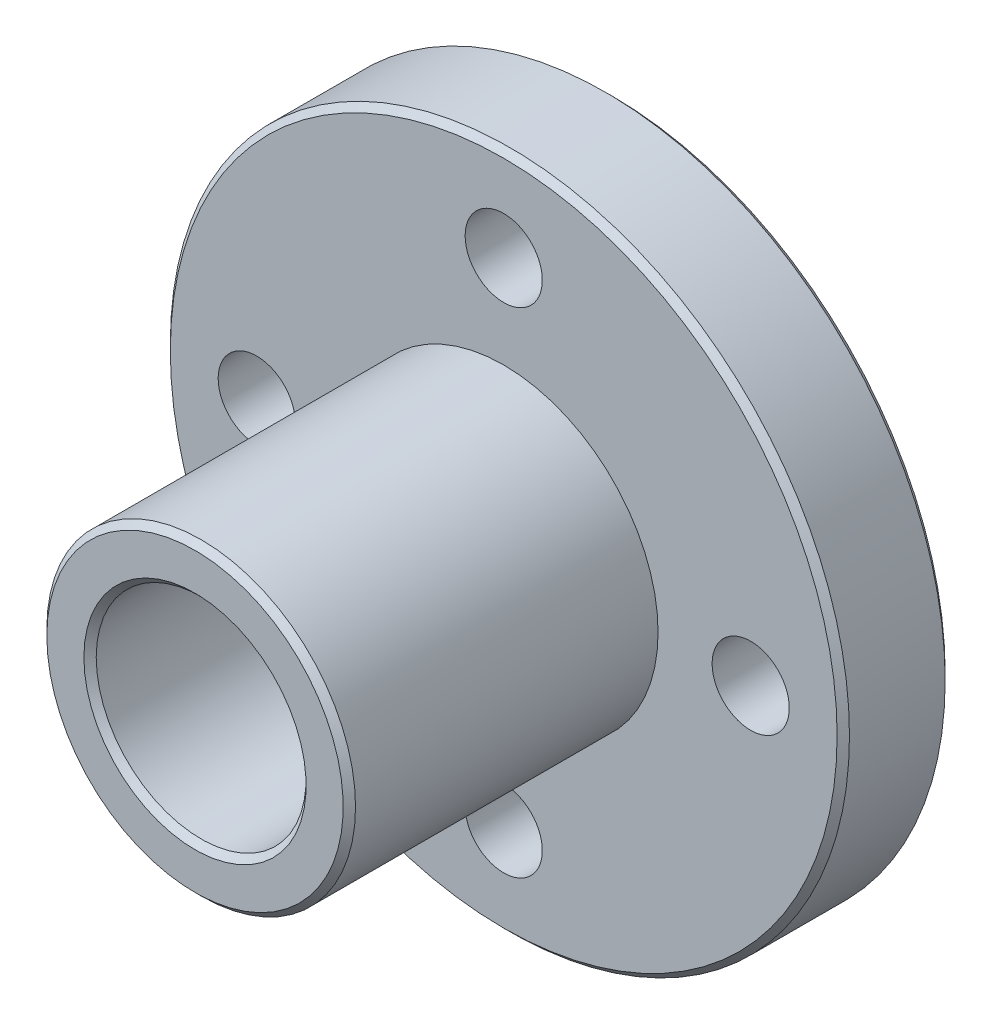
ISO-10303-21;
HEADER;
FILE_DESCRIPTION(('STEP AP214'),'2;1');
FILE_NAME('part.step','',(''),(''),'','','');
FILE_SCHEMA(('AUTOMOTIVE_DESIGN { 1 0 10303 214 1 1 1 1 }'));
ENDSEC;
DATA;
#1=APPLICATION_CONTEXT('core data for automotive mechanical design processes');
#2=APPLICATION_PROTOCOL_DEFINITION('international standard','automotive_design',2000,#1);
#3=PRODUCT_CONTEXT('',#1,'mechanical');
#4=PRODUCT('Part','Part','',(#3));
#5=PRODUCT_RELATED_PRODUCT_CATEGORY('part','',(#4));
#6=PRODUCT_DEFINITION_FORMATION('','',#4);
#7=PRODUCT_DEFINITION_CONTEXT('part definition',#1,'design');
#8=PRODUCT_DEFINITION('design','',#6,#7);
#9=PRODUCT_DEFINITION_SHAPE('','',#8);
#10=(LENGTH_UNIT() NAMED_UNIT(*) SI_UNIT(.MILLI.,.METRE.));
#11=(NAMED_UNIT(*) PLANE_ANGLE_UNIT() SI_UNIT($,.RADIAN.));
#12=(NAMED_UNIT(*) SI_UNIT($,.STERADIAN.) SOLID_ANGLE_UNIT());
#13=UNCERTAINTY_MEASURE_WITH_UNIT(LENGTH_MEASURE(1.E-05),#10,'distance_accuracy_value','');
#14=(GEOMETRIC_REPRESENTATION_CONTEXT(3) GLOBAL_UNCERTAINTY_ASSIGNED_CONTEXT((#13)) GLOBAL_UNIT_ASSIGNED_CONTEXT((#10,
#11,#12)) REPRESENTATION_CONTEXT('',''));
#15=CARTESIAN_POINT('',(0.,0.,0.));
#16=DIRECTION('',(0.,0.,1.));
#17=DIRECTION('',(1.,0.,0.));
#18=AXIS2_PLACEMENT_3D('',#15,#16,#17);
#19=CARTESIAN_POINT('',(0.,0.,-5.));
#20=DIRECTION('',(0.,0.,1.));
#21=DIRECTION('',(1.,0.,0.));
#22=AXIS2_PLACEMENT_3D('',#19,#20,#21);
#23=PLANE('',#22);
#24=CARTESIAN_POINT('',(0.,0.,-5.));
#25=DIRECTION('',(0.,0.,1.));
#26=DIRECTION('',(1.,0.,0.));
#27=AXIS2_PLACEMENT_3D('',#24,#25,#26);
#28=CIRCLE('',#27,3.6);
#29=CARTESIAN_POINT('',(3.6,0.,-5.));
#30=VERTEX_POINT('',#29);
#31=EDGE_CURVE('E40',#30,#30,#28,.T.);
#32=ORIENTED_EDGE('',*,*,#31,.T.);
#33=EDGE_LOOP('',(#32));
#34=FACE_BOUND('',#33,.T.);
#35=CARTESIAN_POINT('',(0.,0.,-5.));
#36=DIRECTION('',(0.,0.,-1.));
#37=DIRECTION('',(1.,0.,0.));
#38=AXIS2_PLACEMENT_3D('',#35,#36,#37);
#39=CIRCLE('',#38,4.8);
#40=CARTESIAN_POINT('',(4.8,0.,-5.));
#41=VERTEX_POINT('',#40);
#42=EDGE_CURVE('E44',#41,#41,#39,.T.);
#43=ORIENTED_EDGE('',*,*,#42,.T.);
#44=EDGE_LOOP('',(#43));
#45=FACE_BOUND('',#44,.T.);
#46=ADVANCED_FACE('F14',(#34,#45),#23,.F.);
#47=CARTESIAN_POINT('',(5.,0.,-3.5));
#48=DIRECTION('',(0.,0.,1.));
#49=DIRECTION('',(1.,0.,0.));
#50=AXIS2_PLACEMENT_3D('',#47,#48,#49);
#51=PLANE('',#50);
#52=CARTESIAN_POINT('',(8.,0.,-3.5));
#53=DIRECTION('',(0.,0.,-1.));
#54=DIRECTION('',(1.,0.,0.));
#55=AXIS2_PLACEMENT_3D('',#52,#53,#54);
#56=CIRCLE('',#55,1.25);
#57=CARTESIAN_POINT('',(9.25,0.,-3.5));
#58=VERTEX_POINT('',#57);
#59=EDGE_CURVE('E45',#58,#58,#56,.T.);
#60=ORIENTED_EDGE('',*,*,#59,.F.);
#61=EDGE_LOOP('',(#60));
#62=FACE_BOUND('',#61,.T.);
#63=CARTESIAN_POINT('',(-8.,0.,-3.5));
#64=DIRECTION('',(0.,0.,-1.));
#65=DIRECTION('',(1.,0.,0.));
#66=AXIS2_PLACEMENT_3D('',#63,#64,#65);
#67=CIRCLE('',#66,1.25);
#68=CARTESIAN_POINT('',(-6.75,0.,-3.5));
#69=VERTEX_POINT('',#68);
#70=EDGE_CURVE('E53',#69,#69,#67,.T.);
#71=ORIENTED_EDGE('',*,*,#70,.F.);
#72=EDGE_LOOP('',(#71));
#73=FACE_BOUND('',#72,.T.);
#74=CARTESIAN_POINT('',(0.,-8.,-3.5));
#75=DIRECTION('',(0.,0.,-1.));
#76=DIRECTION('',(1.,0.,0.));
#77=AXIS2_PLACEMENT_3D('',#74,#75,#76);
#78=CIRCLE('',#77,1.25);
#79=CARTESIAN_POINT('',(1.25,-8.,-3.5));
#80=VERTEX_POINT('',#79);
#81=EDGE_CURVE('E61',#80,#80,#78,.T.);
#82=ORIENTED_EDGE('',*,*,#81,.F.);
#83=EDGE_LOOP('',(#82));
#84=FACE_BOUND('',#83,.T.);
#85=CARTESIAN_POINT('',(0.,8.,-3.5));
#86=DIRECTION('',(0.,0.,-1.));
#87=DIRECTION('',(1.,0.,0.));
#88=AXIS2_PLACEMENT_3D('',#85,#86,#87);
#89=CIRCLE('',#88,1.25);
#90=CARTESIAN_POINT('',(1.25,8.,-3.5));
#91=VERTEX_POINT('',#90);
#92=EDGE_CURVE('E69',#91,#91,#89,.T.);
#93=ORIENTED_EDGE('',*,*,#92,.F.);
#94=EDGE_LOOP('',(#93));
#95=FACE_BOUND('',#94,.T.);
#96=CARTESIAN_POINT('',(0.,0.,-3.5));
#97=DIRECTION('',(0.,0.,1.));
#98=DIRECTION('',(1.,0.,0.));
#99=AXIS2_PLACEMENT_3D('',#96,#97,#98);
#100=CIRCLE('',#99,5.);
#101=CARTESIAN_POINT('',(5.,0.,-3.5));
#102=VERTEX_POINT('',#101);
#103=EDGE_CURVE('E104',#102,#102,#100,.T.);
#104=ORIENTED_EDGE('',*,*,#103,.T.);
#105=EDGE_LOOP('',(#104));
#106=FACE_BOUND('',#105,.T.);
#107=CARTESIAN_POINT('',(0.,0.,-3.5));
#108=DIRECTION('',(0.,0.,-1.));
#109=DIRECTION('',(1.,0.,0.));
#110=AXIS2_PLACEMENT_3D('',#107,#108,#109);
#111=CIRCLE('',#110,10.8);
#112=CARTESIAN_POINT('',(10.8,0.,-3.5));
#113=VERTEX_POINT('',#112);
#114=EDGE_CURVE('E21',#113,#113,#111,.T.);
#115=ORIENTED_EDGE('',*,*,#114,.T.);
#116=EDGE_LOOP('',(#115));
#117=FACE_BOUND('',#116,.T.);
#118=ADVANCED_FACE('F129',(#62,#73,#84,#95,#106,#117),#51,.F.);
#119=CARTESIAN_POINT('',(11.,0.,0.));
#120=DIRECTION('',(0.,0.,-1.));
#121=DIRECTION('',(0.,-1.,0.));
#122=AXIS2_PLACEMENT_3D('',#119,#120,#121);
#123=PLANE('',#122);
#124=CARTESIAN_POINT('',(8.,0.,0.));
#125=DIRECTION('',(0.,0.,1.));
#126=DIRECTION('',(-1.,0.,0.));
#127=AXIS2_PLACEMENT_3D('',#124,#125,#126);
#128=CIRCLE('',#127,1.25);
#129=CARTESIAN_POINT('',(6.75,0.,0.));
#130=VERTEX_POINT('',#129);
#131=EDGE_CURVE('E49',#130,#130,#128,.T.);
#132=ORIENTED_EDGE('',*,*,#131,.F.);
#133=EDGE_LOOP('',(#132));
#134=FACE_BOUND('',#133,.T.);
#135=CARTESIAN_POINT('',(-8.,0.,0.));
#136=DIRECTION('',(0.,0.,1.));
#137=DIRECTION('',(-1.,0.,0.));
#138=AXIS2_PLACEMENT_3D('',#135,#136,#137);
#139=CIRCLE('',#138,1.25);
#140=CARTESIAN_POINT('',(-9.25,0.,0.));
#141=VERTEX_POINT('',#140);
#142=EDGE_CURVE('E57',#141,#141,#139,.T.);
#143=ORIENTED_EDGE('',*,*,#142,.F.);
#144=EDGE_LOOP('',(#143));
#145=FACE_BOUND('',#144,.T.);
#146=CARTESIAN_POINT('',(0.,-8.,0.));
#147=DIRECTION('',(0.,0.,1.));
#148=DIRECTION('',(-1.,0.,0.));
#149=AXIS2_PLACEMENT_3D('',#146,#147,#148);
#150=CIRCLE('',#149,1.25);
#151=CARTESIAN_POINT('',(-1.25,-8.,0.));
#152=VERTEX_POINT('',#151);
#153=EDGE_CURVE('E65',#152,#152,#150,.T.);
#154=ORIENTED_EDGE('',*,*,#153,.F.);
#155=EDGE_LOOP('',(#154));
#156=FACE_BOUND('',#155,.T.);
#157=CARTESIAN_POINT('',(0.,8.,0.));
#158=DIRECTION('',(0.,0.,1.));
#159=DIRECTION('',(-1.,0.,0.));
#160=AXIS2_PLACEMENT_3D('',#157,#158,#159);
#161=CIRCLE('',#160,1.25);
#162=CARTESIAN_POINT('',(-1.25,8.,0.));
#163=VERTEX_POINT('',#162);
#164=EDGE_CURVE('E73',#163,#163,#161,.T.);
#165=ORIENTED_EDGE('',*,*,#164,.F.);
#166=EDGE_LOOP('',(#165));
#167=FACE_BOUND('',#166,.T.);
#168=CARTESIAN_POINT('',(0.,0.,0.));
#169=DIRECTION('',(0.,0.,1.));
#170=DIRECTION('',(1.,0.,0.));
#171=AXIS2_PLACEMENT_3D('',#168,#169,#170);
#172=CIRCLE('',#171,5.);
#173=CARTESIAN_POINT('',(5.,0.,0.));
#174=VERTEX_POINT('',#173);
#175=EDGE_CURVE('E89',#174,#174,#172,.T.);
#176=ORIENTED_EDGE('',*,*,#175,.F.);
#177=EDGE_LOOP('',(#176));
#178=FACE_BOUND('',#177,.T.);
#179=CARTESIAN_POINT('',(0.,0.,0.));
#180=DIRECTION('',(0.,0.,1.));
#181=DIRECTION('',(-1.,0.,0.));
#182=AXIS2_PLACEMENT_3D('',#179,#180,#181);
#183=CIRCLE('',#182,10.8);
#184=CARTESIAN_POINT('',(-10.8,0.,0.));
#185=VERTEX_POINT('',#184);
#186=EDGE_CURVE('E9',#185,#185,#183,.T.);
#187=ORIENTED_EDGE('',*,*,#186,.T.);
#188=EDGE_LOOP('',(#187));
#189=FACE_BOUND('',#188,.T.);
#190=ADVANCED_FACE('F135',(#134,#145,#156,#167,#178,#189),#123,.F.);
#191=CARTESIAN_POINT('',(5.,0.,10.));
#192=DIRECTION('',(0.,0.,-1.));
#193=DIRECTION('',(0.,-1.,0.));
#194=AXIS2_PLACEMENT_3D('',#191,#192,#193);
#195=PLANE('',#194);
#196=CARTESIAN_POINT('',(0.,0.,10.));
#197=DIRECTION('',(0.,0.,-1.));
#198=DIRECTION('',(-1.,0.,0.));
#199=AXIS2_PLACEMENT_3D('',#196,#197,#198);
#200=CIRCLE('',#199,3.6);
#201=CARTESIAN_POINT('',(-3.6,0.,10.));
#202=VERTEX_POINT('',#201);
#203=EDGE_CURVE('E37',#202,#202,#200,.T.);
#204=ORIENTED_EDGE('',*,*,#203,.T.);
#205=EDGE_LOOP('',(#204));
#206=FACE_BOUND('',#205,.T.);
#207=CARTESIAN_POINT('',(0.,0.,10.));
#208=DIRECTION('',(0.,0.,1.));
#209=DIRECTION('',(-1.,0.,0.));
#210=AXIS2_PLACEMENT_3D('',#207,#208,#209);
#211=CIRCLE('',#210,4.8);
#212=CARTESIAN_POINT('',(-4.8,0.,10.));
#213=VERTEX_POINT('',#212);
#214=EDGE_CURVE('E30',#213,#213,#211,.T.);
#215=ORIENTED_EDGE('',*,*,#214,.T.);
#216=EDGE_LOOP('',(#215));
#217=FACE_BOUND('',#216,.T.);
#218=ADVANCED_FACE('F168',(#206,#217),#195,.F.);
#219=CARTESIAN_POINT('',(0.,0.,0.));
#220=DIRECTION('',(0.,0.,-1.));
#221=DIRECTION('',(-1.,0.,0.));
#222=AXIS2_PLACEMENT_3D('',#219,#220,#221);
#223=CONICAL_SURFACE('',#222,10.8,0.78539816339745);
#224=CARTESIAN_POINT('',(0.,0.,-0.2));
#225=DIRECTION('',(0.,0.,-1.));
#226=DIRECTION('',(-1.,0.,0.));
#227=AXIS2_PLACEMENT_3D('',#224,#225,#226);
#228=CIRCLE('',#227,11.);
#229=CARTESIAN_POINT('',(-11.,0.,-0.200000000000002));
#230=VERTEX_POINT('',#229);
#231=EDGE_CURVE('E96',#230,#230,#228,.T.);
#232=ORIENTED_EDGE('',*,*,#231,.F.);
#233=EDGE_LOOP('',(#232));
#234=FACE_BOUND('',#233,.T.);
#235=ORIENTED_EDGE('',*,*,#186,.F.);
#236=EDGE_LOOP('',(#235));
#237=FACE_BOUND('',#236,.T.);
#238=ADVANCED_FACE('F165',(#234,#237),#223,.T.);
#239=CARTESIAN_POINT('',(0.,0.,-3.3));
#240=DIRECTION('',(0.,0.,1.));
#241=DIRECTION('',(1.,0.,0.));
#242=AXIS2_PLACEMENT_3D('',#239,#240,#241);
#243=CONICAL_SURFACE('',#242,11.,0.785398163397459);
#244=CARTESIAN_POINT('',(0.,0.,-3.3));
#245=DIRECTION('',(0.,0.,1.));
#246=DIRECTION('',(1.,0.,0.));
#247=AXIS2_PLACEMENT_3D('',#244,#245,#246);
#248=CIRCLE('',#247,11.);
#249=CARTESIAN_POINT('',(11.,0.,-3.3));
#250=VERTEX_POINT('',#249);
#251=EDGE_CURVE('E100',#250,#250,#248,.T.);
#252=ORIENTED_EDGE('',*,*,#251,.F.);
#253=EDGE_LOOP('',(#252));
#254=FACE_BOUND('',#253,.T.);
#255=ORIENTED_EDGE('',*,*,#114,.F.);
#256=EDGE_LOOP('',(#255));
#257=FACE_BOUND('',#256,.T.);
#258=ADVANCED_FACE('F160',(#254,#257),#243,.T.);
#259=CARTESIAN_POINT('',(0.,0.,10.));
#260=DIRECTION('',(0.,0.,-1.));
#261=DIRECTION('',(-1.,0.,0.));
#262=AXIS2_PLACEMENT_3D('',#259,#260,#261);
#263=CONICAL_SURFACE('',#262,4.8,0.785398163397442);
#264=CARTESIAN_POINT('',(0.,0.,9.8));
#265=DIRECTION('',(0.,0.,-1.));
#266=DIRECTION('',(-1.,0.,0.));
#267=AXIS2_PLACEMENT_3D('',#264,#265,#266);
#268=CIRCLE('',#267,5.);
#269=CARTESIAN_POINT('',(-5.,0.,9.8));
#270=VERTEX_POINT('',#269);
#271=EDGE_CURVE('E82',#270,#270,#268,.T.);
#272=ORIENTED_EDGE('',*,*,#271,.F.);
#273=EDGE_LOOP('',(#272));
#274=FACE_BOUND('',#273,.T.);
#275=ORIENTED_EDGE('',*,*,#214,.F.);
#276=EDGE_LOOP('',(#275));
#277=FACE_BOUND('',#276,.T.);
#278=ADVANCED_FACE('F154',(#274,#277),#263,.T.);
#279=CARTESIAN_POINT('',(0.,0.,9.8));
#280=DIRECTION('',(0.,0.,1.));
#281=DIRECTION('',(1.,0.,0.));
#282=AXIS2_PLACEMENT_3D('',#279,#280,#281);
#283=CONICAL_SURFACE('',#282,3.4,0.785398163397448);
#284=ORIENTED_EDGE('',*,*,#203,.F.);
#285=EDGE_LOOP('',(#284));
#286=FACE_BOUND('',#285,.T.);
#287=CARTESIAN_POINT('',(0.,0.,9.8));
#288=DIRECTION('',(0.,0.,1.));
#289=DIRECTION('',(-1.,0.,0.));
#290=AXIS2_PLACEMENT_3D('',#287,#288,#289);
#291=CIRCLE('',#290,3.4);
#292=CARTESIAN_POINT('',(-3.4,0.,9.8));
#293=VERTEX_POINT('',#292);
#294=EDGE_CURVE('E78',#293,#293,#291,.T.);
#295=ORIENTED_EDGE('',*,*,#294,.F.);
#296=EDGE_LOOP('',(#295));
#297=FACE_BOUND('',#296,.T.);
#298=ADVANCED_FACE('F124',(#286,#297),#283,.F.);
#299=CARTESIAN_POINT('',(0.,0.,-4.8));
#300=DIRECTION('',(0.,0.,1.));
#301=DIRECTION('',(1.,0.,0.));
#302=AXIS2_PLACEMENT_3D('',#299,#300,#301);
#303=CONICAL_SURFACE('',#302,5.,0.785398163397448);
#304=CARTESIAN_POINT('',(0.,0.,-4.8));
#305=DIRECTION('',(0.,0.,1.));
#306=DIRECTION('',(1.,0.,0.));
#307=AXIS2_PLACEMENT_3D('',#304,#305,#306);
#308=CIRCLE('',#307,5.);
#309=CARTESIAN_POINT('',(5.,0.,-4.8));
#310=VERTEX_POINT('',#309);
#311=EDGE_CURVE('E108',#310,#310,#308,.T.);
#312=ORIENTED_EDGE('',*,*,#311,.F.);
#313=EDGE_LOOP('',(#312));
#314=FACE_BOUND('',#313,.T.);
#315=ORIENTED_EDGE('',*,*,#42,.F.);
#316=EDGE_LOOP('',(#315));
#317=FACE_BOUND('',#316,.T.);
#318=ADVANCED_FACE('F120',(#314,#317),#303,.T.);
#319=CARTESIAN_POINT('',(0.,0.,-4.8));
#320=DIRECTION('',(0.,0.,-1.));
#321=DIRECTION('',(-1.,0.,0.));
#322=AXIS2_PLACEMENT_3D('',#319,#320,#321);
#323=CONICAL_SURFACE('',#322,3.4,0.785398163397452);
#324=ORIENTED_EDGE('',*,*,#31,.F.);
#325=EDGE_LOOP('',(#324));
#326=FACE_BOUND('',#325,.T.);
#327=CARTESIAN_POINT('',(0.,0.,-4.8));
#328=DIRECTION('',(0.,0.,-1.));
#329=DIRECTION('',(1.,0.,0.));
#330=AXIS2_PLACEMENT_3D('',#327,#328,#329);
#331=CIRCLE('',#330,3.4);
#332=CARTESIAN_POINT('',(3.4,0.,-4.8));
#333=VERTEX_POINT('',#332);
#334=EDGE_CURVE('E77',#333,#333,#331,.T.);
#335=ORIENTED_EDGE('',*,*,#334,.F.);
#336=EDGE_LOOP('',(#335));
#337=FACE_BOUND('',#336,.T.);
#338=ADVANCED_FACE('F123',(#326,#337),#323,.F.);
#339=CARTESIAN_POINT('',(8.,0.,20.));
#340=DIRECTION('',(0.,0.,-1.));
#341=DIRECTION('',(-1.,0.,0.));
#342=AXIS2_PLACEMENT_3D('',#339,#340,#341);
#343=CYLINDRICAL_SURFACE('',#342,1.25);
#344=ORIENTED_EDGE('',*,*,#59,.T.);
#345=EDGE_LOOP('',(#344));
#346=FACE_BOUND('',#345,.T.);
#347=ORIENTED_EDGE('',*,*,#131,.T.);
#348=EDGE_LOOP('',(#347));
#349=FACE_BOUND('',#348,.T.);
#350=ADVANCED_FACE('F141',(#346,#349),#343,.F.);
#351=CARTESIAN_POINT('',(-8.,0.,20.));
#352=DIRECTION('',(0.,0.,-1.));
#353=DIRECTION('',(-1.,0.,0.));
#354=AXIS2_PLACEMENT_3D('',#351,#352,#353);
#355=CYLINDRICAL_SURFACE('',#354,1.25);
#356=ORIENTED_EDGE('',*,*,#70,.T.);
#357=EDGE_LOOP('',(#356));
#358=FACE_BOUND('',#357,.T.);
#359=ORIENTED_EDGE('',*,*,#142,.T.);
#360=EDGE_LOOP('',(#359));
#361=FACE_BOUND('',#360,.T.);
#362=ADVANCED_FACE('F204',(#358,#361),#355,.F.);
#363=CARTESIAN_POINT('',(0.,-8.,20.));
#364=DIRECTION('',(0.,0.,-1.));
#365=DIRECTION('',(-1.,0.,0.));
#366=AXIS2_PLACEMENT_3D('',#363,#364,#365);
#367=CYLINDRICAL_SURFACE('',#366,1.25);
#368=ORIENTED_EDGE('',*,*,#81,.T.);
#369=EDGE_LOOP('',(#368));
#370=FACE_BOUND('',#369,.T.);
#371=ORIENTED_EDGE('',*,*,#153,.T.);
#372=EDGE_LOOP('',(#371));
#373=FACE_BOUND('',#372,.T.);
#374=ADVANCED_FACE('F201',(#370,#373),#367,.F.);
#375=CARTESIAN_POINT('',(0.,8.,20.));
#376=DIRECTION('',(0.,0.,-1.));
#377=DIRECTION('',(-1.,0.,0.));
#378=AXIS2_PLACEMENT_3D('',#375,#376,#377);
#379=CYLINDRICAL_SURFACE('',#378,1.25);
#380=ORIENTED_EDGE('',*,*,#92,.T.);
#381=EDGE_LOOP('',(#380));
#382=FACE_BOUND('',#381,.T.);
#383=ORIENTED_EDGE('',*,*,#164,.T.);
#384=EDGE_LOOP('',(#383));
#385=FACE_BOUND('',#384,.T.);
#386=ADVANCED_FACE('F149',(#382,#385),#379,.F.);
#387=CARTESIAN_POINT('',(0.,0.,20.));
#388=DIRECTION('',(0.,0.,-1.));
#389=DIRECTION('',(-1.,0.,0.));
#390=AXIS2_PLACEMENT_3D('',#387,#388,#389);
#391=CYLINDRICAL_SURFACE('',#390,3.4);
#392=ORIENTED_EDGE('',*,*,#334,.T.);
#393=EDGE_LOOP('',(#392));
#394=FACE_BOUND('',#393,.T.);
#395=ORIENTED_EDGE('',*,*,#294,.T.);
#396=EDGE_LOOP('',(#395));
#397=FACE_BOUND('',#396,.T.);
#398=ADVANCED_FACE('F145',(#394,#397),#391,.F.);
#399=CARTESIAN_POINT('',(0.,0.,-5.));
#400=DIRECTION('',(0.,0.,1.));
#401=DIRECTION('',(1.,0.,0.));
#402=AXIS2_PLACEMENT_3D('',#399,#400,#401);
#403=CYLINDRICAL_SURFACE('',#402,5.);
#404=ORIENTED_EDGE('',*,*,#271,.T.);
#405=EDGE_LOOP('',(#404));
#406=FACE_BOUND('',#405,.T.);
#407=ORIENTED_EDGE('',*,*,#175,.T.);
#408=EDGE_LOOP('',(#407));
#409=FACE_BOUND('',#408,.T.);
#410=ADVANCED_FACE('F148',(#406,#409),#403,.T.);
#411=CARTESIAN_POINT('',(0.,0.,-5.));
#412=DIRECTION('',(0.,0.,1.));
#413=DIRECTION('',(1.,0.,0.));
#414=AXIS2_PLACEMENT_3D('',#411,#412,#413);
#415=CYLINDRICAL_SURFACE('',#414,11.);
#416=ORIENTED_EDGE('',*,*,#231,.T.);
#417=EDGE_LOOP('',(#416));
#418=FACE_BOUND('',#417,.T.);
#419=ORIENTED_EDGE('',*,*,#251,.T.);
#420=EDGE_LOOP('',(#419));
#421=FACE_BOUND('',#420,.T.);
#422=ADVANCED_FACE('F188',(#418,#421),#415,.T.);
#423=CARTESIAN_POINT('',(0.,0.,-5.));
#424=DIRECTION('',(0.,0.,1.));
#425=DIRECTION('',(1.,0.,0.));
#426=AXIS2_PLACEMENT_3D('',#423,#424,#425);
#427=CYLINDRICAL_SURFACE('',#426,5.);
#428=ORIENTED_EDGE('',*,*,#103,.F.);
#429=EDGE_LOOP('',(#428));
#430=FACE_BOUND('',#429,.T.);
#431=ORIENTED_EDGE('',*,*,#311,.T.);
#432=EDGE_LOOP('',(#431));
#433=FACE_BOUND('',#432,.T.);
#434=ADVANCED_FACE('F118',(#430,#433),#427,.T.);
#435=CLOSED_SHELL('',(#46,#118,#190,#218,#238,#258,#278,#298,#318,#338,#350,#362,#374,#386,#398,
#410,#422,#434));
#436=MANIFOLD_SOLID_BREP('B1',#435);
#437=ADVANCED_BREP_SHAPE_REPRESENTATION('',(#18,#436),#14);
#438=SHAPE_DEFINITION_REPRESENTATION(#9,#437);
ENDSEC;
END-ISO-10303-21;
